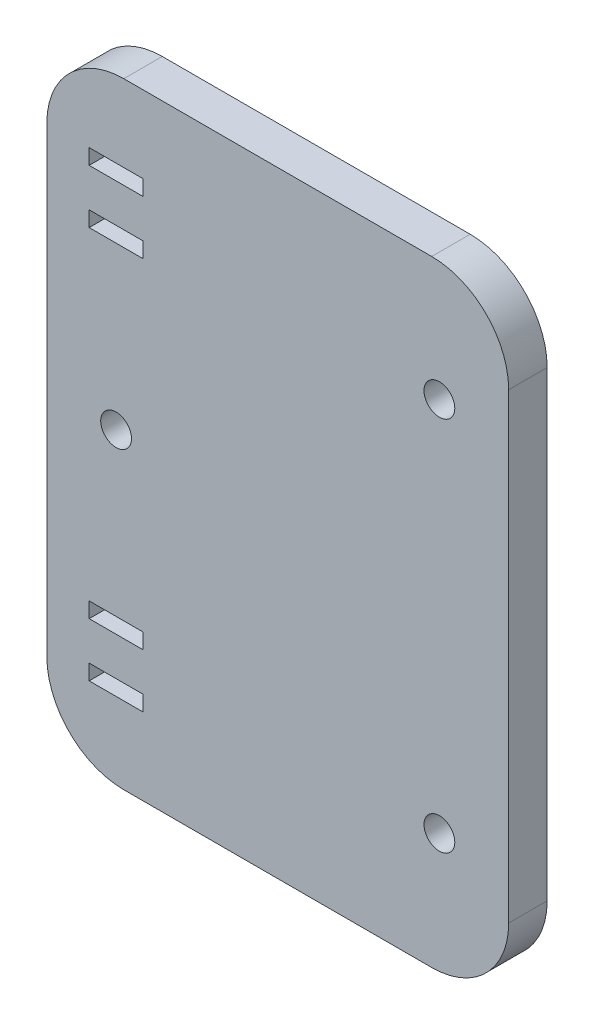
ISO-10303-21;
HEADER;
FILE_DESCRIPTION(('STEP AP214'),'2;1');
FILE_NAME('part.step','',(''),(''),'','','');
FILE_SCHEMA(('AUTOMOTIVE_DESIGN { 1 0 10303 214 1 1 1 1 }'));
ENDSEC;
DATA;
#1=APPLICATION_CONTEXT('core data for automotive mechanical design processes');
#2=APPLICATION_PROTOCOL_DEFINITION('international standard','automotive_design',2000,#1);
#3=PRODUCT_CONTEXT('',#1,'mechanical');
#4=PRODUCT('Part','Part','',(#3));
#5=PRODUCT_RELATED_PRODUCT_CATEGORY('part','',(#4));
#6=PRODUCT_DEFINITION_FORMATION('','',#4);
#7=PRODUCT_DEFINITION_CONTEXT('part definition',#1,'design');
#8=PRODUCT_DEFINITION('design','',#6,#7);
#9=PRODUCT_DEFINITION_SHAPE('','',#8);
#10=(LENGTH_UNIT() NAMED_UNIT(*) SI_UNIT(.MILLI.,.METRE.));
#11=(NAMED_UNIT(*) PLANE_ANGLE_UNIT() SI_UNIT($,.RADIAN.));
#12=(NAMED_UNIT(*) SI_UNIT($,.STERADIAN.) SOLID_ANGLE_UNIT());
#13=UNCERTAINTY_MEASURE_WITH_UNIT(LENGTH_MEASURE(1.E-05),#10,'distance_accuracy_value','');
#14=(GEOMETRIC_REPRESENTATION_CONTEXT(3) GLOBAL_UNCERTAINTY_ASSIGNED_CONTEXT((#13)) GLOBAL_UNIT_ASSIGNED_CONTEXT((#10,
#11,#12)) REPRESENTATION_CONTEXT('',''));
#15=CARTESIAN_POINT('',(0.,0.,0.));
#16=DIRECTION('',(0.,0.,1.));
#17=DIRECTION('',(1.,0.,0.));
#18=AXIS2_PLACEMENT_3D('',#15,#16,#17);
#19=CARTESIAN_POINT('',(-60.,0.,5.));
#20=DIRECTION('',(0.,1.,0.));
#21=DIRECTION('',(0.,0.,1.));
#22=AXIS2_PLACEMENT_3D('',#19,#20,#21);
#23=PLANE('',#22);
#24=DIRECTION('',(1.,0.,0.));
#25=VECTOR('',#24,1.);
#26=CARTESIAN_POINT('',(-60.,0.,5.));
#27=LINE('',#26,#25);
#28=CARTESIAN_POINT('',(-50.,0.,5.));
#29=VERTEX_POINT('',#28);
#30=CARTESIAN_POINT('',(-10.,0.,5.));
#31=VERTEX_POINT('',#30);
#32=EDGE_CURVE('E414',#29,#31,#27,.T.);
#33=ORIENTED_EDGE('',*,*,#32,.F.);
#34=DIRECTION('',(0.,0.,-1.));
#35=VECTOR('',#34,1.);
#36=CARTESIAN_POINT('',(-50.,0.,5.));
#37=LINE('',#36,#35);
#38=CARTESIAN_POINT('',(-50.,0.,0.));
#39=VERTEX_POINT('',#38);
#40=EDGE_CURVE('E445',#29,#39,#37,.T.);
#41=ORIENTED_EDGE('',*,*,#40,.T.);
#42=DIRECTION('',(1.,0.,0.));
#43=VECTOR('',#42,1.);
#44=CARTESIAN_POINT('',(-60.,0.,0.));
#45=LINE('',#44,#43);
#46=CARTESIAN_POINT('',(-10.,0.,0.));
#47=VERTEX_POINT('',#46);
#48=EDGE_CURVE('E394',#39,#47,#45,.T.);
#49=ORIENTED_EDGE('',*,*,#48,.T.);
#50=DIRECTION('',(0.,0.,-1.));
#51=VECTOR('',#50,1.);
#52=CARTESIAN_POINT('',(-10.,0.,5.));
#53=LINE('',#52,#51);
#54=EDGE_CURVE('E429',#47,#31,#53,.F.);
#55=ORIENTED_EDGE('',*,*,#54,.T.);
#56=EDGE_LOOP('',(#33,#41,#49,#55));
#57=FACE_BOUND('',#56,.T.);
#58=ADVANCED_FACE('F39',(#57),#23,.F.);
#59=CARTESIAN_POINT('',(0.,0.,5.));
#60=DIRECTION('',(-1.,0.,0.));
#61=DIRECTION('',(0.,0.,1.));
#62=AXIS2_PLACEMENT_3D('',#59,#60,#61);
#63=PLANE('',#62);
#64=DIRECTION('',(0.,1.,0.));
#65=VECTOR('',#64,1.);
#66=CARTESIAN_POINT('',(0.,0.,5.));
#67=LINE('',#66,#65);
#68=CARTESIAN_POINT('',(0.,10.,5.));
#69=VERTEX_POINT('',#68);
#70=CARTESIAN_POINT('',(0.,70.,5.));
#71=VERTEX_POINT('',#70);
#72=EDGE_CURVE('E418',#69,#71,#67,.T.);
#73=ORIENTED_EDGE('',*,*,#72,.F.);
#74=DIRECTION('',(0.,0.,-1.));
#75=VECTOR('',#74,1.);
#76=CARTESIAN_POINT('',(0.,10.,5.));
#77=LINE('',#76,#75);
#78=CARTESIAN_POINT('',(0.,10.,0.));
#79=VERTEX_POINT('',#78);
#80=EDGE_CURVE('E482',#69,#79,#77,.T.);
#81=ORIENTED_EDGE('',*,*,#80,.T.);
#82=DIRECTION('',(0.,1.,0.));
#83=VECTOR('',#82,1.);
#84=CARTESIAN_POINT('',(0.,0.,0.));
#85=LINE('',#84,#83);
#86=CARTESIAN_POINT('',(0.,70.,0.));
#87=VERTEX_POINT('',#86);
#88=EDGE_CURVE('E433',#79,#87,#85,.T.);
#89=ORIENTED_EDGE('',*,*,#88,.T.);
#90=DIRECTION('',(0.,0.,-1.));
#91=VECTOR('',#90,1.);
#92=CARTESIAN_POINT('',(0.,70.,5.));
#93=LINE('',#92,#91);
#94=EDGE_CURVE('E479',#87,#71,#93,.F.);
#95=ORIENTED_EDGE('',*,*,#94,.T.);
#96=EDGE_LOOP('',(#73,#81,#89,#95));
#97=FACE_BOUND('',#96,.T.);
#98=ADVANCED_FACE('F490',(#97),#63,.F.);
#99=CARTESIAN_POINT('',(0.,80.,5.));
#100=DIRECTION('',(0.,-1.,0.));
#101=DIRECTION('',(0.,0.,-1.));
#102=AXIS2_PLACEMENT_3D('',#99,#100,#101);
#103=PLANE('',#102);
#104=DIRECTION('',(-1.,0.,0.));
#105=VECTOR('',#104,1.);
#106=CARTESIAN_POINT('',(0.,80.,5.));
#107=LINE('',#106,#105);
#108=CARTESIAN_POINT('',(-10.,80.,5.));
#109=VERTEX_POINT('',#108);
#110=CARTESIAN_POINT('',(-50.,80.,5.));
#111=VERTEX_POINT('',#110);
#112=EDGE_CURVE('E422',#109,#111,#107,.T.);
#113=ORIENTED_EDGE('',*,*,#112,.F.);
#114=DIRECTION('',(0.,0.,-1.));
#115=VECTOR('',#114,1.);
#116=CARTESIAN_POINT('',(-10.,80.,5.));
#117=LINE('',#116,#115);
#118=CARTESIAN_POINT('',(-10.,80.,0.));
#119=VERTEX_POINT('',#118);
#120=EDGE_CURVE('E11',#109,#119,#117,.T.);
#121=ORIENTED_EDGE('',*,*,#120,.T.);
#122=DIRECTION('',(-1.,0.,0.));
#123=VECTOR('',#122,1.);
#124=CARTESIAN_POINT('',(0.,80.,0.));
#125=LINE('',#124,#123);
#126=CARTESIAN_POINT('',(-50.,80.,0.));
#127=VERTEX_POINT('',#126);
#128=EDGE_CURVE('E437',#119,#127,#125,.T.);
#129=ORIENTED_EDGE('',*,*,#128,.T.);
#130=DIRECTION('',(0.,0.,-1.));
#131=VECTOR('',#130,1.);
#132=CARTESIAN_POINT('',(-50.,80.,5.));
#133=LINE('',#132,#131);
#134=EDGE_CURVE('E48',#127,#111,#133,.F.);
#135=ORIENTED_EDGE('',*,*,#134,.T.);
#136=EDGE_LOOP('',(#113,#121,#129,#135));
#137=FACE_BOUND('',#136,.T.);
#138=ADVANCED_FACE('F500',(#137),#103,.F.);
#139=CARTESIAN_POINT('',(-60.,80.,5.));
#140=DIRECTION('',(1.,0.,0.));
#141=DIRECTION('',(0.,1.,0.));
#142=AXIS2_PLACEMENT_3D('',#139,#140,#141);
#143=PLANE('',#142);
#144=DIRECTION('',(0.,-1.,0.));
#145=VECTOR('',#144,1.);
#146=CARTESIAN_POINT('',(-60.,80.,0.));
#147=LINE('',#146,#145);
#148=CARTESIAN_POINT('',(-60.,70.,0.));
#149=VERTEX_POINT('',#148);
#150=CARTESIAN_POINT('',(-60.,9.99999999999999,0.));
#151=VERTEX_POINT('',#150);
#152=EDGE_CURVE('E419',#149,#151,#147,.T.);
#153=ORIENTED_EDGE('',*,*,#152,.T.);
#154=DIRECTION('',(0.,0.,-1.));
#155=VECTOR('',#154,1.);
#156=CARTESIAN_POINT('',(-60.,9.99999999999999,5.));
#157=LINE('',#156,#155);
#158=CARTESIAN_POINT('',(-60.,9.99999999999999,5.));
#159=VERTEX_POINT('',#158);
#160=EDGE_CURVE('E465',#151,#159,#157,.F.);
#161=ORIENTED_EDGE('',*,*,#160,.T.);
#162=DIRECTION('',(0.,-1.,0.));
#163=VECTOR('',#162,1.);
#164=CARTESIAN_POINT('',(-60.,80.,5.));
#165=LINE('',#164,#163);
#166=CARTESIAN_POINT('',(-60.,70.,5.));
#167=VERTEX_POINT('',#166);
#168=EDGE_CURVE('E425',#167,#159,#165,.T.);
#169=ORIENTED_EDGE('',*,*,#168,.F.);
#170=DIRECTION('',(0.,0.,-1.));
#171=VECTOR('',#170,1.);
#172=CARTESIAN_POINT('',(-60.,70.,5.));
#173=LINE('',#172,#171);
#174=EDGE_CURVE('E461',#167,#149,#173,.T.);
#175=ORIENTED_EDGE('',*,*,#174,.T.);
#176=EDGE_LOOP('',(#153,#161,#169,#175));
#177=FACE_BOUND('',#176,.T.);
#178=ADVANCED_FACE('F508',(#177),#143,.F.);
#179=CARTESIAN_POINT('',(0.,0.,5.));
#180=DIRECTION('',(0.,0.,1.));
#181=DIRECTION('',(1.,0.,0.));
#182=AXIS2_PLACEMENT_3D('',#179,#180,#181);
#183=PLANE('',#182);
#184=DIRECTION('',(1.,0.,0.));
#185=VECTOR('',#184,1.);
#186=CARTESIAN_POINT('',(-54.5,9.99999999999999,5.));
#187=LINE('',#186,#185);
#188=CARTESIAN_POINT('',(-54.5,9.99999999999999,5.));
#189=VERTEX_POINT('',#188);
#190=CARTESIAN_POINT('',(-47.5,9.99999999999999,5.));
#191=VERTEX_POINT('',#190);
#192=EDGE_CURVE('E321',#189,#191,#187,.T.);
#193=ORIENTED_EDGE('',*,*,#192,.F.);
#194=DIRECTION('',(0.,-1.,0.));
#195=VECTOR('',#194,1.);
#196=CARTESIAN_POINT('',(-54.5,9.99999999999999,5.));
#197=LINE('',#196,#195);
#198=CARTESIAN_POINT('',(-54.5,12.,5.));
#199=VERTEX_POINT('',#198);
#200=EDGE_CURVE('E308',#199,#189,#197,.T.);
#201=ORIENTED_EDGE('',*,*,#200,.F.);
#202=DIRECTION('',(-1.,0.,0.));
#203=VECTOR('',#202,1.);
#204=CARTESIAN_POINT('',(-54.5,12.,5.));
#205=LINE('',#204,#203);
#206=CARTESIAN_POINT('',(-47.5,12.,5.));
#207=VERTEX_POINT('',#206);
#208=EDGE_CURVE('E328',#207,#199,#205,.T.);
#209=ORIENTED_EDGE('',*,*,#208,.F.);
#210=DIRECTION('',(0.,1.,0.));
#211=VECTOR('',#210,1.);
#212=CARTESIAN_POINT('',(-47.5,9.99999999999999,5.));
#213=LINE('',#212,#211);
#214=EDGE_CURVE('E324',#191,#207,#213,.T.);
#215=ORIENTED_EDGE('',*,*,#214,.F.);
#216=EDGE_LOOP('',(#193,#201,#209,#215));
#217=FACE_BOUND('',#216,.T.);
#218=DIRECTION('',(1.,0.,0.));
#219=VECTOR('',#218,1.);
#220=CARTESIAN_POINT('',(-54.5,17.,5.));
#221=LINE('',#220,#219);
#222=CARTESIAN_POINT('',(-54.5,17.,5.));
#223=VERTEX_POINT('',#222);
#224=CARTESIAN_POINT('',(-47.5,17.,5.));
#225=VERTEX_POINT('',#224);
#226=EDGE_CURVE('E277',#223,#225,#221,.T.);
#227=ORIENTED_EDGE('',*,*,#226,.F.);
#228=DIRECTION('',(0.,-1.,0.));
#229=VECTOR('',#228,1.);
#230=CARTESIAN_POINT('',(-54.5,17.,5.));
#231=LINE('',#230,#229);
#232=CARTESIAN_POINT('',(-54.5,19.,5.));
#233=VERTEX_POINT('',#232);
#234=EDGE_CURVE('E264',#233,#223,#231,.T.);
#235=ORIENTED_EDGE('',*,*,#234,.F.);
#236=DIRECTION('',(-1.,0.,0.));
#237=VECTOR('',#236,1.);
#238=CARTESIAN_POINT('',(-54.5,19.,5.));
#239=LINE('',#238,#237);
#240=CARTESIAN_POINT('',(-47.5,19.,5.));
#241=VERTEX_POINT('',#240);
#242=EDGE_CURVE('E285',#241,#233,#239,.T.);
#243=ORIENTED_EDGE('',*,*,#242,.F.);
#244=DIRECTION('',(0.,1.,0.));
#245=VECTOR('',#244,1.);
#246=CARTESIAN_POINT('',(-47.5,17.,5.));
#247=LINE('',#246,#245);
#248=EDGE_CURVE('E280',#225,#241,#247,.T.);
#249=ORIENTED_EDGE('',*,*,#248,.F.);
#250=EDGE_LOOP('',(#227,#235,#243,#249));
#251=FACE_BOUND('',#250,.T.);
#252=DIRECTION('',(0.,-1.,0.));
#253=VECTOR('',#252,1.);
#254=CARTESIAN_POINT('',(-54.5,70.,5.));
#255=LINE('',#254,#253);
#256=CARTESIAN_POINT('',(-54.5,70.,5.));
#257=VERTEX_POINT('',#256);
#258=CARTESIAN_POINT('',(-54.5,68.,5.));
#259=VERTEX_POINT('',#258);
#260=EDGE_CURVE('E209',#257,#259,#255,.T.);
#261=ORIENTED_EDGE('',*,*,#260,.F.);
#262=DIRECTION('',(-1.,0.,0.));
#263=VECTOR('',#262,1.);
#264=CARTESIAN_POINT('',(-54.5,70.,5.));
#265=LINE('',#264,#263);
#266=CARTESIAN_POINT('',(-47.5,70.,5.));
#267=VERTEX_POINT('',#266);
#268=EDGE_CURVE('E230',#267,#257,#265,.T.);
#269=ORIENTED_EDGE('',*,*,#268,.F.);
#270=DIRECTION('',(0.,1.,0.));
#271=VECTOR('',#270,1.);
#272=CARTESIAN_POINT('',(-47.5,70.,5.));
#273=LINE('',#272,#271);
#274=CARTESIAN_POINT('',(-47.5,68.,5.));
#275=VERTEX_POINT('',#274);
#276=EDGE_CURVE('E234',#275,#267,#273,.T.);
#277=ORIENTED_EDGE('',*,*,#276,.F.);
#278=DIRECTION('',(1.,0.,0.));
#279=VECTOR('',#278,1.);
#280=CARTESIAN_POINT('',(-54.5,68.,5.));
#281=LINE('',#280,#279);
#282=EDGE_CURVE('E243',#259,#275,#281,.T.);
#283=ORIENTED_EDGE('',*,*,#282,.F.);
#284=EDGE_LOOP('',(#261,#269,#277,#283));
#285=FACE_BOUND('',#284,.T.);
#286=DIRECTION('',(0.,-1.,0.));
#287=VECTOR('',#286,1.);
#288=CARTESIAN_POINT('',(-54.5,63.,5.));
#289=LINE('',#288,#287);
#290=CARTESIAN_POINT('',(-54.5,63.,5.));
#291=VERTEX_POINT('',#290);
#292=CARTESIAN_POINT('',(-54.5,61.,5.));
#293=VERTEX_POINT('',#292);
#294=EDGE_CURVE('E253',#291,#293,#289,.T.);
#295=ORIENTED_EDGE('',*,*,#294,.F.);
#296=DIRECTION('',(-1.,0.,0.));
#297=VECTOR('',#296,1.);
#298=CARTESIAN_POINT('',(-54.5,63.,5.));
#299=LINE('',#298,#297);
#300=CARTESIAN_POINT('',(-47.5,63.,5.));
#301=VERTEX_POINT('',#300);
#302=EDGE_CURVE('E351',#301,#291,#299,.T.);
#303=ORIENTED_EDGE('',*,*,#302,.F.);
#304=DIRECTION('',(0.,1.,0.));
#305=VECTOR('',#304,1.);
#306=CARTESIAN_POINT('',(-47.5,63.,5.));
#307=LINE('',#306,#305);
#308=CARTESIAN_POINT('',(-47.5,61.,5.));
#309=VERTEX_POINT('',#308);
#310=EDGE_CURVE('E370',#309,#301,#307,.T.);
#311=ORIENTED_EDGE('',*,*,#310,.F.);
#312=DIRECTION('',(1.,0.,0.));
#313=VECTOR('',#312,1.);
#314=CARTESIAN_POINT('',(-54.5,61.,5.));
#315=LINE('',#314,#313);
#316=EDGE_CURVE('E366',#293,#309,#315,.T.);
#317=ORIENTED_EDGE('',*,*,#316,.F.);
#318=EDGE_LOOP('',(#295,#303,#311,#317));
#319=FACE_BOUND('',#318,.T.);
#320=CARTESIAN_POINT('',(-9.00000000000001,64.4115427318801,5.));
#321=DIRECTION('',(0.,0.,1.));
#322=DIRECTION('',(1.,0.,0.));
#323=AXIS2_PLACEMENT_3D('',#320,#321,#322);
#324=CIRCLE('',#323,2.);
#325=CARTESIAN_POINT('',(-7.,64.4115427318801,5.));
#326=VERTEX_POINT('',#325);
#327=EDGE_CURVE('E395',#326,#326,#324,.T.);
#328=ORIENTED_EDGE('',*,*,#327,.F.);
#329=EDGE_LOOP('',(#328));
#330=FACE_BOUND('',#329,.T.);
#331=CARTESIAN_POINT('',(-9.00000000000001,15.5884572681199,5.));
#332=DIRECTION('',(0.,0.,1.));
#333=DIRECTION('',(1.,0.,0.));
#334=AXIS2_PLACEMENT_3D('',#331,#332,#333);
#335=CIRCLE('',#334,2.);
#336=CARTESIAN_POINT('',(-7.,15.5884572681199,5.));
#337=VERTEX_POINT('',#336);
#338=EDGE_CURVE('E403',#337,#337,#335,.T.);
#339=ORIENTED_EDGE('',*,*,#338,.F.);
#340=EDGE_LOOP('',(#339));
#341=FACE_BOUND('',#340,.T.);
#342=CARTESIAN_POINT('',(-51.,40.,5.));
#343=DIRECTION('',(0.,0.,1.));
#344=DIRECTION('',(1.,0.,0.));
#345=AXIS2_PLACEMENT_3D('',#342,#343,#344);
#346=CIRCLE('',#345,2.);
#347=CARTESIAN_POINT('',(-49.,40.,5.));
#348=VERTEX_POINT('',#347);
#349=EDGE_CURVE('E380',#348,#348,#346,.T.);
#350=ORIENTED_EDGE('',*,*,#349,.F.);
#351=EDGE_LOOP('',(#350));
#352=FACE_BOUND('',#351,.T.);
#353=ORIENTED_EDGE('',*,*,#168,.T.);
#354=CARTESIAN_POINT('',(-50.,10.,5.));
#355=DIRECTION('',(0.,0.,1.));
#356=DIRECTION('',(1.,0.,0.));
#357=AXIS2_PLACEMENT_3D('',#354,#355,#356);
#358=CIRCLE('',#357,10.);
#359=EDGE_CURVE('E476',#159,#29,#358,.T.);
#360=ORIENTED_EDGE('',*,*,#359,.T.);
#361=ORIENTED_EDGE('',*,*,#32,.T.);
#362=CARTESIAN_POINT('',(-10.,10.,5.));
#363=DIRECTION('',(0.,0.,1.));
#364=DIRECTION('',(1.,0.,0.));
#365=AXIS2_PLACEMENT_3D('',#362,#363,#364);
#366=CIRCLE('',#365,10.);
#367=EDGE_CURVE('E473',#31,#69,#366,.T.);
#368=ORIENTED_EDGE('',*,*,#367,.T.);
#369=ORIENTED_EDGE('',*,*,#72,.T.);
#370=CARTESIAN_POINT('',(-10.,70.,5.));
#371=DIRECTION('',(0.,0.,1.));
#372=DIRECTION('',(1.,0.,0.));
#373=AXIS2_PLACEMENT_3D('',#370,#371,#372);
#374=CIRCLE('',#373,10.);
#375=EDGE_CURVE('E61',#71,#109,#374,.T.);
#376=ORIENTED_EDGE('',*,*,#375,.T.);
#377=ORIENTED_EDGE('',*,*,#112,.T.);
#378=CARTESIAN_POINT('',(-50.,70.,5.));
#379=DIRECTION('',(0.,0.,1.));
#380=DIRECTION('',(1.,0.,0.));
#381=AXIS2_PLACEMENT_3D('',#378,#379,#380);
#382=CIRCLE('',#381,10.);
#383=EDGE_CURVE('E468',#111,#167,#382,.T.);
#384=ORIENTED_EDGE('',*,*,#383,.T.);
#385=EDGE_LOOP('',(#353,#360,#361,#368,#369,#376,#377,#384));
#386=FACE_BOUND('',#385,.T.);
#387=ADVANCED_FACE('F502',(#217,#251,#285,#319,#330,#341,#352,#386),#183,.T.);
#388=CARTESIAN_POINT('',(0.,0.,0.));
#389=DIRECTION('',(0.,0.,1.));
#390=DIRECTION('',(1.,0.,0.));
#391=AXIS2_PLACEMENT_3D('',#388,#389,#390);
#392=PLANE('',#391);
#393=DIRECTION('',(0.,-1.,0.));
#394=VECTOR('',#393,1.);
#395=CARTESIAN_POINT('',(-54.5,9.99999999999999,0.));
#396=LINE('',#395,#394);
#397=CARTESIAN_POINT('',(-54.5,12.,0.));
#398=VERTEX_POINT('',#397);
#399=CARTESIAN_POINT('',(-54.5,9.99999999999999,0.));
#400=VERTEX_POINT('',#399);
#401=EDGE_CURVE('E316',#398,#400,#396,.T.);
#402=ORIENTED_EDGE('',*,*,#401,.T.);
#403=DIRECTION('',(1.,0.,0.));
#404=VECTOR('',#403,1.);
#405=CARTESIAN_POINT('',(-54.5,9.99999999999999,0.));
#406=LINE('',#405,#404);
#407=CARTESIAN_POINT('',(-47.5,9.99999999999999,0.));
#408=VERTEX_POINT('',#407);
#409=EDGE_CURVE('E303',#400,#408,#406,.T.);
#410=ORIENTED_EDGE('',*,*,#409,.T.);
#411=DIRECTION('',(0.,1.,0.));
#412=VECTOR('',#411,1.);
#413=CARTESIAN_POINT('',(-47.5,9.99999999999999,0.));
#414=LINE('',#413,#412);
#415=CARTESIAN_POINT('',(-47.5,12.,0.));
#416=VERTEX_POINT('',#415);
#417=EDGE_CURVE('E307',#408,#416,#414,.T.);
#418=ORIENTED_EDGE('',*,*,#417,.T.);
#419=DIRECTION('',(-1.,0.,0.));
#420=VECTOR('',#419,1.);
#421=CARTESIAN_POINT('',(-54.5,12.,0.));
#422=LINE('',#421,#420);
#423=EDGE_CURVE('E312',#416,#398,#422,.T.);
#424=ORIENTED_EDGE('',*,*,#423,.T.);
#425=EDGE_LOOP('',(#402,#410,#418,#424));
#426=FACE_BOUND('',#425,.T.);
#427=DIRECTION('',(0.,-1.,0.));
#428=VECTOR('',#427,1.);
#429=CARTESIAN_POINT('',(-54.5,17.,0.));
#430=LINE('',#429,#428);
#431=CARTESIAN_POINT('',(-54.5,19.,0.));
#432=VERTEX_POINT('',#431);
#433=CARTESIAN_POINT('',(-54.5,17.,0.));
#434=VERTEX_POINT('',#433);
#435=EDGE_CURVE('E272',#432,#434,#430,.T.);
#436=ORIENTED_EDGE('',*,*,#435,.T.);
#437=DIRECTION('',(1.,0.,0.));
#438=VECTOR('',#437,1.);
#439=CARTESIAN_POINT('',(-54.5,17.,0.));
#440=LINE('',#439,#438);
#441=CARTESIAN_POINT('',(-47.5,17.,0.));
#442=VERTEX_POINT('',#441);
#443=EDGE_CURVE('E259',#434,#442,#440,.T.);
#444=ORIENTED_EDGE('',*,*,#443,.T.);
#445=DIRECTION('',(0.,1.,0.));
#446=VECTOR('',#445,1.);
#447=CARTESIAN_POINT('',(-47.5,17.,0.));
#448=LINE('',#447,#446);
#449=CARTESIAN_POINT('',(-47.5,19.,0.));
#450=VERTEX_POINT('',#449);
#451=EDGE_CURVE('E263',#442,#450,#448,.T.);
#452=ORIENTED_EDGE('',*,*,#451,.T.);
#453=DIRECTION('',(-1.,0.,0.));
#454=VECTOR('',#453,1.);
#455=CARTESIAN_POINT('',(-54.5,19.,0.));
#456=LINE('',#455,#454);
#457=EDGE_CURVE('E268',#450,#432,#456,.T.);
#458=ORIENTED_EDGE('',*,*,#457,.T.);
#459=EDGE_LOOP('',(#436,#444,#452,#458));
#460=FACE_BOUND('',#459,.T.);
#461=DIRECTION('',(-1.,0.,0.));
#462=VECTOR('',#461,1.);
#463=CARTESIAN_POINT('',(-54.5,70.,0.));
#464=LINE('',#463,#462);
#465=CARTESIAN_POINT('',(-47.5,70.,0.));
#466=VERTEX_POINT('',#465);
#467=CARTESIAN_POINT('',(-54.5,70.,0.));
#468=VERTEX_POINT('',#467);
#469=EDGE_CURVE('E215',#466,#468,#464,.T.);
#470=ORIENTED_EDGE('',*,*,#469,.T.);
#471=DIRECTION('',(0.,-1.,0.));
#472=VECTOR('',#471,1.);
#473=CARTESIAN_POINT('',(-54.5,70.,0.));
#474=LINE('',#473,#472);
#475=CARTESIAN_POINT('',(-54.5,68.,0.));
#476=VERTEX_POINT('',#475);
#477=EDGE_CURVE('E206',#468,#476,#474,.T.);
#478=ORIENTED_EDGE('',*,*,#477,.T.);
#479=DIRECTION('',(1.,0.,0.));
#480=VECTOR('',#479,1.);
#481=CARTESIAN_POINT('',(-54.5,68.,0.));
#482=LINE('',#481,#480);
#483=CARTESIAN_POINT('',(-47.5,68.,0.));
#484=VERTEX_POINT('',#483);
#485=EDGE_CURVE('E219',#476,#484,#482,.T.);
#486=ORIENTED_EDGE('',*,*,#485,.T.);
#487=DIRECTION('',(0.,1.,0.));
#488=VECTOR('',#487,1.);
#489=CARTESIAN_POINT('',(-47.5,70.,0.));
#490=LINE('',#489,#488);
#491=EDGE_CURVE('E224',#484,#466,#490,.T.);
#492=ORIENTED_EDGE('',*,*,#491,.T.);
#493=EDGE_LOOP('',(#470,#478,#486,#492));
#494=FACE_BOUND('',#493,.T.);
#495=DIRECTION('',(-1.,0.,0.));
#496=VECTOR('',#495,1.);
#497=CARTESIAN_POINT('',(-54.5,63.,0.));
#498=LINE('',#497,#496);
#499=CARTESIAN_POINT('',(-47.5,63.,0.));
#500=VERTEX_POINT('',#499);
#501=CARTESIAN_POINT('',(-54.5,63.,0.));
#502=VERTEX_POINT('',#501);
#503=EDGE_CURVE('E359',#500,#502,#498,.T.);
#504=ORIENTED_EDGE('',*,*,#503,.T.);
#505=DIRECTION('',(0.,-1.,0.));
#506=VECTOR('',#505,1.);
#507=CARTESIAN_POINT('',(-54.5,63.,0.));
#508=LINE('',#507,#506);
#509=CARTESIAN_POINT('',(-54.5,61.,0.));
#510=VERTEX_POINT('',#509);
#511=EDGE_CURVE('E346',#502,#510,#508,.T.);
#512=ORIENTED_EDGE('',*,*,#511,.T.);
#513=DIRECTION('',(1.,0.,0.));
#514=VECTOR('',#513,1.);
#515=CARTESIAN_POINT('',(-54.5,61.,0.));
#516=LINE('',#515,#514);
#517=CARTESIAN_POINT('',(-47.5,61.,0.));
#518=VERTEX_POINT('',#517);
#519=EDGE_CURVE('E350',#510,#518,#516,.T.);
#520=ORIENTED_EDGE('',*,*,#519,.T.);
#521=DIRECTION('',(0.,1.,0.));
#522=VECTOR('',#521,1.);
#523=CARTESIAN_POINT('',(-47.5,63.,0.));
#524=LINE('',#523,#522);
#525=EDGE_CURVE('E355',#518,#500,#524,.T.);
#526=ORIENTED_EDGE('',*,*,#525,.T.);
#527=EDGE_LOOP('',(#504,#512,#520,#526));
#528=FACE_BOUND('',#527,.T.);
#529=CARTESIAN_POINT('',(-9.00000000000001,64.4115427318801,0.));
#530=DIRECTION('',(0.,0.,1.));
#531=DIRECTION('',(1.,0.,0.));
#532=AXIS2_PLACEMENT_3D('',#529,#530,#531);
#533=CIRCLE('',#532,2.);
#534=CARTESIAN_POINT('',(-7.,64.4115427318801,0.));
#535=VERTEX_POINT('',#534);
#536=EDGE_CURVE('E390',#535,#535,#533,.T.);
#537=ORIENTED_EDGE('',*,*,#536,.T.);
#538=EDGE_LOOP('',(#537));
#539=FACE_BOUND('',#538,.T.);
#540=CARTESIAN_POINT('',(-9.00000000000001,15.5884572681199,0.));
#541=DIRECTION('',(0.,0.,1.));
#542=DIRECTION('',(1.,0.,0.));
#543=AXIS2_PLACEMENT_3D('',#540,#541,#542);
#544=CIRCLE('',#543,2.);
#545=CARTESIAN_POINT('',(-7.,15.5884572681199,0.));
#546=VERTEX_POINT('',#545);
#547=EDGE_CURVE('E399',#546,#546,#544,.T.);
#548=ORIENTED_EDGE('',*,*,#547,.T.);
#549=EDGE_LOOP('',(#548));
#550=FACE_BOUND('',#549,.T.);
#551=CARTESIAN_POINT('',(-51.,40.,0.));
#552=DIRECTION('',(0.,0.,1.));
#553=DIRECTION('',(1.,0.,0.));
#554=AXIS2_PLACEMENT_3D('',#551,#552,#553);
#555=CIRCLE('',#554,2.);
#556=CARTESIAN_POINT('',(-49.,40.,0.));
#557=VERTEX_POINT('',#556);
#558=EDGE_CURVE('E407',#557,#557,#555,.T.);
#559=ORIENTED_EDGE('',*,*,#558,.T.);
#560=EDGE_LOOP('',(#559));
#561=FACE_BOUND('',#560,.T.);
#562=ORIENTED_EDGE('',*,*,#48,.F.);
#563=CARTESIAN_POINT('',(-50.,10.,0.));
#564=DIRECTION('',(0.,0.,1.));
#565=DIRECTION('',(1.,0.,0.));
#566=AXIS2_PLACEMENT_3D('',#563,#564,#565);
#567=CIRCLE('',#566,10.);
#568=EDGE_CURVE('E458',#39,#151,#567,.F.);
#569=ORIENTED_EDGE('',*,*,#568,.T.);
#570=ORIENTED_EDGE('',*,*,#152,.F.);
#571=CARTESIAN_POINT('',(-50.,70.,0.));
#572=DIRECTION('',(0.,0.,1.));
#573=DIRECTION('',(1.,0.,0.));
#574=AXIS2_PLACEMENT_3D('',#571,#572,#573);
#575=CIRCLE('',#574,10.);
#576=EDGE_CURVE('E449',#149,#127,#575,.F.);
#577=ORIENTED_EDGE('',*,*,#576,.T.);
#578=ORIENTED_EDGE('',*,*,#128,.F.);
#579=CARTESIAN_POINT('',(-10.,70.,0.));
#580=DIRECTION('',(0.,0.,1.));
#581=DIRECTION('',(1.,0.,0.));
#582=AXIS2_PLACEMENT_3D('',#579,#580,#581);
#583=CIRCLE('',#582,10.);
#584=EDGE_CURVE('E452',#119,#87,#583,.F.);
#585=ORIENTED_EDGE('',*,*,#584,.T.);
#586=ORIENTED_EDGE('',*,*,#88,.F.);
#587=CARTESIAN_POINT('',(-10.,10.,0.));
#588=DIRECTION('',(0.,0.,1.));
#589=DIRECTION('',(1.,0.,0.));
#590=AXIS2_PLACEMENT_3D('',#587,#588,#589);
#591=CIRCLE('',#590,10.);
#592=EDGE_CURVE('E455',#79,#47,#591,.F.);
#593=ORIENTED_EDGE('',*,*,#592,.T.);
#594=EDGE_LOOP('',(#562,#569,#570,#577,#578,#585,#586,#593));
#595=FACE_BOUND('',#594,.T.);
#596=ADVANCED_FACE('F226',(#426,#460,#494,#528,#539,#550,#561,#595),#392,.F.);
#597=CARTESIAN_POINT('',(-51.,40.,0.));
#598=DIRECTION('',(0.,0.,1.));
#599=DIRECTION('',(1.,0.,0.));
#600=AXIS2_PLACEMENT_3D('',#597,#598,#599);
#601=CYLINDRICAL_SURFACE('',#600,2.);
#602=ORIENTED_EDGE('',*,*,#558,.F.);
#603=EDGE_LOOP('',(#602));
#604=FACE_BOUND('',#603,.T.);
#605=ORIENTED_EDGE('',*,*,#349,.T.);
#606=EDGE_LOOP('',(#605));
#607=FACE_BOUND('',#606,.T.);
#608=ADVANCED_FACE('F539',(#604,#607),#601,.F.);
#609=CARTESIAN_POINT('',(-9.00000000000001,15.5884572681199,0.));
#610=DIRECTION('',(0.,0.,1.));
#611=DIRECTION('',(1.,0.,0.));
#612=AXIS2_PLACEMENT_3D('',#609,#610,#611);
#613=CYLINDRICAL_SURFACE('',#612,2.);
#614=ORIENTED_EDGE('',*,*,#547,.F.);
#615=EDGE_LOOP('',(#614));
#616=FACE_BOUND('',#615,.T.);
#617=ORIENTED_EDGE('',*,*,#338,.T.);
#618=EDGE_LOOP('',(#617));
#619=FACE_BOUND('',#618,.T.);
#620=ADVANCED_FACE('F546',(#616,#619),#613,.F.);
#621=CARTESIAN_POINT('',(-9.00000000000001,64.4115427318801,0.));
#622=DIRECTION('',(0.,0.,1.));
#623=DIRECTION('',(1.,0.,0.));
#624=AXIS2_PLACEMENT_3D('',#621,#622,#623);
#625=CYLINDRICAL_SURFACE('',#624,2.);
#626=ORIENTED_EDGE('',*,*,#536,.F.);
#627=EDGE_LOOP('',(#626));
#628=FACE_BOUND('',#627,.T.);
#629=ORIENTED_EDGE('',*,*,#327,.T.);
#630=EDGE_LOOP('',(#629));
#631=FACE_BOUND('',#630,.T.);
#632=ADVANCED_FACE('F550',(#628,#631),#625,.F.);
#633=CARTESIAN_POINT('',(-54.5,63.,0.));
#634=DIRECTION('',(-1.,0.,0.));
#635=DIRECTION('',(0.,0.,1.));
#636=AXIS2_PLACEMENT_3D('',#633,#634,#635);
#637=PLANE('',#636);
#638=ORIENTED_EDGE('',*,*,#294,.T.);
#639=DIRECTION('',(0.,0.,1.));
#640=VECTOR('',#639,1.);
#641=CARTESIAN_POINT('',(-54.5,61.,0.));
#642=LINE('',#641,#640);
#643=EDGE_CURVE('E363',#510,#293,#642,.T.);
#644=ORIENTED_EDGE('',*,*,#643,.F.);
#645=ORIENTED_EDGE('',*,*,#511,.F.);
#646=DIRECTION('',(0.,0.,1.));
#647=VECTOR('',#646,1.);
#648=CARTESIAN_POINT('',(-54.5,63.,0.));
#649=LINE('',#648,#647);
#650=EDGE_CURVE('E377',#502,#291,#649,.T.);
#651=ORIENTED_EDGE('',*,*,#650,.T.);
#652=EDGE_LOOP('',(#638,#644,#645,#651));
#653=FACE_BOUND('',#652,.T.);
#654=ADVANCED_FACE('F554',(#653),#637,.F.);
#655=CARTESIAN_POINT('',(-54.5,63.,0.));
#656=DIRECTION('',(0.,1.,0.));
#657=DIRECTION('',(0.,0.,1.));
#658=AXIS2_PLACEMENT_3D('',#655,#656,#657);
#659=PLANE('',#658);
#660=ORIENTED_EDGE('',*,*,#302,.T.);
#661=ORIENTED_EDGE('',*,*,#650,.F.);
#662=ORIENTED_EDGE('',*,*,#503,.F.);
#663=DIRECTION('',(0.,0.,1.));
#664=VECTOR('',#663,1.);
#665=CARTESIAN_POINT('',(-47.5,63.,0.));
#666=LINE('',#665,#664);
#667=EDGE_CURVE('E381',#500,#301,#666,.T.);
#668=ORIENTED_EDGE('',*,*,#667,.T.);
#669=EDGE_LOOP('',(#660,#661,#662,#668));
#670=FACE_BOUND('',#669,.T.);
#671=ADVANCED_FACE('F558',(#670),#659,.F.);
#672=CARTESIAN_POINT('',(-47.5,63.,0.));
#673=DIRECTION('',(1.,0.,0.));
#674=DIRECTION('',(0.,0.,-1.));
#675=AXIS2_PLACEMENT_3D('',#672,#673,#674);
#676=PLANE('',#675);
#677=ORIENTED_EDGE('',*,*,#310,.T.);
#678=ORIENTED_EDGE('',*,*,#667,.F.);
#679=ORIENTED_EDGE('',*,*,#525,.F.);
#680=DIRECTION('',(0.,0.,1.));
#681=VECTOR('',#680,1.);
#682=CARTESIAN_POINT('',(-47.5,61.,0.));
#683=LINE('',#682,#681);
#684=EDGE_CURVE('E384',#518,#309,#683,.T.);
#685=ORIENTED_EDGE('',*,*,#684,.T.);
#686=EDGE_LOOP('',(#677,#678,#679,#685));
#687=FACE_BOUND('',#686,.T.);
#688=ADVANCED_FACE('F563',(#687),#676,.F.);
#689=CARTESIAN_POINT('',(-54.5,61.,0.));
#690=DIRECTION('',(0.,-1.,0.));
#691=DIRECTION('',(0.,0.,-1.));
#692=AXIS2_PLACEMENT_3D('',#689,#690,#691);
#693=PLANE('',#692);
#694=ORIENTED_EDGE('',*,*,#316,.T.);
#695=ORIENTED_EDGE('',*,*,#684,.F.);
#696=ORIENTED_EDGE('',*,*,#519,.F.);
#697=ORIENTED_EDGE('',*,*,#643,.T.);
#698=EDGE_LOOP('',(#694,#695,#696,#697));
#699=FACE_BOUND('',#698,.T.);
#700=ADVANCED_FACE('F560',(#699),#693,.F.);
#701=CARTESIAN_POINT('',(-54.5,70.,0.));
#702=DIRECTION('',(-1.,0.,0.));
#703=DIRECTION('',(0.,0.,1.));
#704=AXIS2_PLACEMENT_3D('',#701,#702,#703);
#705=PLANE('',#704);
#706=ORIENTED_EDGE('',*,*,#260,.T.);
#707=DIRECTION('',(0.,0.,1.));
#708=VECTOR('',#707,1.);
#709=CARTESIAN_POINT('',(-54.5,68.,0.));
#710=LINE('',#709,#708);
#711=EDGE_CURVE('E202',#476,#259,#710,.T.);
#712=ORIENTED_EDGE('',*,*,#711,.F.);
#713=ORIENTED_EDGE('',*,*,#477,.F.);
#714=DIRECTION('',(0.,0.,1.));
#715=VECTOR('',#714,1.);
#716=CARTESIAN_POINT('',(-54.5,70.,0.));
#717=LINE('',#716,#715);
#718=EDGE_CURVE('E250',#468,#257,#717,.T.);
#719=ORIENTED_EDGE('',*,*,#718,.T.);
#720=EDGE_LOOP('',(#706,#712,#713,#719));
#721=FACE_BOUND('',#720,.T.);
#722=ADVANCED_FACE('F204',(#721),#705,.F.);
#723=CARTESIAN_POINT('',(-54.5,70.,0.));
#724=DIRECTION('',(0.,1.,0.));
#725=DIRECTION('',(0.,0.,1.));
#726=AXIS2_PLACEMENT_3D('',#723,#724,#725);
#727=PLANE('',#726);
#728=ORIENTED_EDGE('',*,*,#268,.T.);
#729=ORIENTED_EDGE('',*,*,#718,.F.);
#730=ORIENTED_EDGE('',*,*,#469,.F.);
#731=DIRECTION('',(0.,0.,1.));
#732=VECTOR('',#731,1.);
#733=CARTESIAN_POINT('',(-47.5,70.,0.));
#734=LINE('',#733,#732);
#735=EDGE_CURVE('E254',#466,#267,#734,.T.);
#736=ORIENTED_EDGE('',*,*,#735,.T.);
#737=EDGE_LOOP('',(#728,#729,#730,#736));
#738=FACE_BOUND('',#737,.T.);
#739=ADVANCED_FACE('F604',(#738),#727,.F.);
#740=CARTESIAN_POINT('',(-47.5,70.,0.));
#741=DIRECTION('',(1.,0.,0.));
#742=DIRECTION('',(0.,0.,-1.));
#743=AXIS2_PLACEMENT_3D('',#740,#741,#742);
#744=PLANE('',#743);
#745=ORIENTED_EDGE('',*,*,#276,.T.);
#746=ORIENTED_EDGE('',*,*,#735,.F.);
#747=ORIENTED_EDGE('',*,*,#491,.F.);
#748=DIRECTION('',(0.,0.,1.));
#749=VECTOR('',#748,1.);
#750=CARTESIAN_POINT('',(-47.5,68.,0.));
#751=LINE('',#750,#749);
#752=EDGE_CURVE('E214',#484,#275,#751,.T.);
#753=ORIENTED_EDGE('',*,*,#752,.T.);
#754=EDGE_LOOP('',(#745,#746,#747,#753));
#755=FACE_BOUND('',#754,.T.);
#756=ADVANCED_FACE('F607',(#755),#744,.F.);
#757=CARTESIAN_POINT('',(-54.5,68.,0.));
#758=DIRECTION('',(0.,-1.,0.));
#759=DIRECTION('',(0.,0.,-1.));
#760=AXIS2_PLACEMENT_3D('',#757,#758,#759);
#761=PLANE('',#760);
#762=ORIENTED_EDGE('',*,*,#282,.T.);
#763=ORIENTED_EDGE('',*,*,#752,.F.);
#764=ORIENTED_EDGE('',*,*,#485,.F.);
#765=ORIENTED_EDGE('',*,*,#711,.T.);
#766=EDGE_LOOP('',(#762,#763,#764,#765));
#767=FACE_BOUND('',#766,.T.);
#768=ADVANCED_FACE('F220',(#767),#761,.F.);
#769=CARTESIAN_POINT('',(-54.5,17.,0.));
#770=DIRECTION('',(0.,-1.,0.));
#771=DIRECTION('',(0.,0.,-1.));
#772=AXIS2_PLACEMENT_3D('',#769,#770,#771);
#773=PLANE('',#772);
#774=ORIENTED_EDGE('',*,*,#226,.T.);
#775=DIRECTION('',(0.,0.,1.));
#776=VECTOR('',#775,1.);
#777=CARTESIAN_POINT('',(-47.5,17.,0.));
#778=LINE('',#777,#776);
#779=EDGE_CURVE('E276',#442,#225,#778,.T.);
#780=ORIENTED_EDGE('',*,*,#779,.F.);
#781=ORIENTED_EDGE('',*,*,#443,.F.);
#782=DIRECTION('',(0.,0.,1.));
#783=VECTOR('',#782,1.);
#784=CARTESIAN_POINT('',(-54.5,17.,0.));
#785=LINE('',#784,#783);
#786=EDGE_CURVE('E244',#434,#223,#785,.T.);
#787=ORIENTED_EDGE('',*,*,#786,.T.);
#788=EDGE_LOOP('',(#774,#780,#781,#787));
#789=FACE_BOUND('',#788,.T.);
#790=ADVANCED_FACE('F587',(#789),#773,.F.);
#791=CARTESIAN_POINT('',(-54.5,17.,0.));
#792=DIRECTION('',(-1.,0.,0.));
#793=DIRECTION('',(0.,0.,1.));
#794=AXIS2_PLACEMENT_3D('',#791,#792,#793);
#795=PLANE('',#794);
#796=ORIENTED_EDGE('',*,*,#234,.T.);
#797=ORIENTED_EDGE('',*,*,#786,.F.);
#798=ORIENTED_EDGE('',*,*,#435,.F.);
#799=DIRECTION('',(0.,0.,1.));
#800=VECTOR('',#799,1.);
#801=CARTESIAN_POINT('',(-54.5,19.,0.));
#802=LINE('',#801,#800);
#803=EDGE_CURVE('E294',#432,#233,#802,.T.);
#804=ORIENTED_EDGE('',*,*,#803,.T.);
#805=EDGE_LOOP('',(#796,#797,#798,#804));
#806=FACE_BOUND('',#805,.T.);
#807=ADVANCED_FACE('F590',(#806),#795,.F.);
#808=CARTESIAN_POINT('',(-54.5,19.,0.));
#809=DIRECTION('',(0.,1.,0.));
#810=DIRECTION('',(0.,0.,1.));
#811=AXIS2_PLACEMENT_3D('',#808,#809,#810);
#812=PLANE('',#811);
#813=ORIENTED_EDGE('',*,*,#242,.T.);
#814=ORIENTED_EDGE('',*,*,#803,.F.);
#815=ORIENTED_EDGE('',*,*,#457,.F.);
#816=DIRECTION('',(0.,0.,1.));
#817=VECTOR('',#816,1.);
#818=CARTESIAN_POINT('',(-47.5,19.,0.));
#819=LINE('',#818,#817);
#820=EDGE_CURVE('E297',#450,#241,#819,.T.);
#821=ORIENTED_EDGE('',*,*,#820,.T.);
#822=EDGE_LOOP('',(#813,#814,#815,#821));
#823=FACE_BOUND('',#822,.T.);
#824=ADVANCED_FACE('F594',(#823),#812,.F.);
#825=CARTESIAN_POINT('',(-47.5,17.,0.));
#826=DIRECTION('',(1.,0.,0.));
#827=DIRECTION('',(0.,0.,-1.));
#828=AXIS2_PLACEMENT_3D('',#825,#826,#827);
#829=PLANE('',#828);
#830=ORIENTED_EDGE('',*,*,#248,.T.);
#831=ORIENTED_EDGE('',*,*,#820,.F.);
#832=ORIENTED_EDGE('',*,*,#451,.F.);
#833=ORIENTED_EDGE('',*,*,#779,.T.);
#834=EDGE_LOOP('',(#830,#831,#832,#833));
#835=FACE_BOUND('',#834,.T.);
#836=ADVANCED_FACE('F575',(#835),#829,.F.);
#837=CARTESIAN_POINT('',(-54.5,9.99999999999999,0.));
#838=DIRECTION('',(0.,-1.,0.));
#839=DIRECTION('',(0.,0.,-1.));
#840=AXIS2_PLACEMENT_3D('',#837,#838,#839);
#841=PLANE('',#840);
#842=ORIENTED_EDGE('',*,*,#192,.T.);
#843=DIRECTION('',(0.,0.,1.));
#844=VECTOR('',#843,1.);
#845=CARTESIAN_POINT('',(-47.5,9.99999999999999,0.));
#846=LINE('',#845,#844);
#847=EDGE_CURVE('E320',#408,#191,#846,.T.);
#848=ORIENTED_EDGE('',*,*,#847,.F.);
#849=ORIENTED_EDGE('',*,*,#409,.F.);
#850=DIRECTION('',(0.,0.,1.));
#851=VECTOR('',#850,1.);
#852=CARTESIAN_POINT('',(-54.5,9.99999999999999,0.));
#853=LINE('',#852,#851);
#854=EDGE_CURVE('E281',#400,#189,#853,.T.);
#855=ORIENTED_EDGE('',*,*,#854,.T.);
#856=EDGE_LOOP('',(#842,#848,#849,#855));
#857=FACE_BOUND('',#856,.T.);
#858=ADVANCED_FACE('F571',(#857),#841,.F.);
#859=CARTESIAN_POINT('',(-54.5,9.99999999999999,0.));
#860=DIRECTION('',(-1.,0.,0.));
#861=DIRECTION('',(0.,0.,1.));
#862=AXIS2_PLACEMENT_3D('',#859,#860,#861);
#863=PLANE('',#862);
#864=ORIENTED_EDGE('',*,*,#200,.T.);
#865=ORIENTED_EDGE('',*,*,#854,.F.);
#866=ORIENTED_EDGE('',*,*,#401,.F.);
#867=DIRECTION('',(0.,0.,1.));
#868=VECTOR('',#867,1.);
#869=CARTESIAN_POINT('',(-54.5,12.,0.));
#870=LINE('',#869,#868);
#871=EDGE_CURVE('E337',#398,#199,#870,.T.);
#872=ORIENTED_EDGE('',*,*,#871,.T.);
#873=EDGE_LOOP('',(#864,#865,#866,#872));
#874=FACE_BOUND('',#873,.T.);
#875=ADVANCED_FACE('F574',(#874),#863,.F.);
#876=CARTESIAN_POINT('',(-54.5,12.,0.));
#877=DIRECTION('',(0.,1.,0.));
#878=DIRECTION('',(0.,0.,1.));
#879=AXIS2_PLACEMENT_3D('',#876,#877,#878);
#880=PLANE('',#879);
#881=ORIENTED_EDGE('',*,*,#208,.T.);
#882=ORIENTED_EDGE('',*,*,#871,.F.);
#883=ORIENTED_EDGE('',*,*,#423,.F.);
#884=DIRECTION('',(0.,0.,1.));
#885=VECTOR('',#884,1.);
#886=CARTESIAN_POINT('',(-47.5,12.,0.));
#887=LINE('',#886,#885);
#888=EDGE_CURVE('E340',#416,#207,#887,.T.);
#889=ORIENTED_EDGE('',*,*,#888,.T.);
#890=EDGE_LOOP('',(#881,#882,#883,#889));
#891=FACE_BOUND('',#890,.T.);
#892=ADVANCED_FACE('F579',(#891),#880,.F.);
#893=CARTESIAN_POINT('',(-47.5,9.99999999999999,0.));
#894=DIRECTION('',(1.,0.,0.));
#895=DIRECTION('',(0.,0.,-1.));
#896=AXIS2_PLACEMENT_3D('',#893,#894,#895);
#897=PLANE('',#896);
#898=ORIENTED_EDGE('',*,*,#214,.T.);
#899=ORIENTED_EDGE('',*,*,#888,.F.);
#900=ORIENTED_EDGE('',*,*,#417,.F.);
#901=ORIENTED_EDGE('',*,*,#847,.T.);
#902=EDGE_LOOP('',(#898,#899,#900,#901));
#903=FACE_BOUND('',#902,.T.);
#904=ADVANCED_FACE('F524',(#903),#897,.F.);
#905=CARTESIAN_POINT('',(-50.,10.,5.));
#906=DIRECTION('',(0.,0.,-1.));
#907=DIRECTION('',(-1.,0.,0.));
#908=AXIS2_PLACEMENT_3D('',#905,#906,#907);
#909=CYLINDRICAL_SURFACE('',#908,10.);
#910=ORIENTED_EDGE('',*,*,#359,.F.);
#911=ORIENTED_EDGE('',*,*,#160,.F.);
#912=ORIENTED_EDGE('',*,*,#568,.F.);
#913=ORIENTED_EDGE('',*,*,#40,.F.);
#914=EDGE_LOOP('',(#910,#911,#912,#913));
#915=FACE_BOUND('',#914,.T.);
#916=ADVANCED_FACE('F513',(#915),#909,.T.);
#917=CARTESIAN_POINT('',(-10.,10.,5.));
#918=DIRECTION('',(0.,0.,-1.));
#919=DIRECTION('',(-1.,0.,0.));
#920=AXIS2_PLACEMENT_3D('',#917,#918,#919);
#921=CYLINDRICAL_SURFACE('',#920,10.);
#922=ORIENTED_EDGE('',*,*,#367,.F.);
#923=ORIENTED_EDGE('',*,*,#54,.F.);
#924=ORIENTED_EDGE('',*,*,#592,.F.);
#925=ORIENTED_EDGE('',*,*,#80,.F.);
#926=EDGE_LOOP('',(#922,#923,#924,#925));
#927=FACE_BOUND('',#926,.T.);
#928=ADVANCED_FACE('F517',(#927),#921,.T.);
#929=CARTESIAN_POINT('',(-10.,70.,5.));
#930=DIRECTION('',(0.,0.,-1.));
#931=DIRECTION('',(-1.,0.,0.));
#932=AXIS2_PLACEMENT_3D('',#929,#930,#931);
#933=CYLINDRICAL_SURFACE('',#932,10.);
#934=ORIENTED_EDGE('',*,*,#375,.F.);
#935=ORIENTED_EDGE('',*,*,#94,.F.);
#936=ORIENTED_EDGE('',*,*,#584,.F.);
#937=ORIENTED_EDGE('',*,*,#120,.F.);
#938=EDGE_LOOP('',(#934,#935,#936,#937));
#939=FACE_BOUND('',#938,.T.);
#940=ADVANCED_FACE('F499',(#939),#933,.T.);
#941=CARTESIAN_POINT('',(-50.,70.,5.));
#942=DIRECTION('',(0.,0.,-1.));
#943=DIRECTION('',(-1.,0.,0.));
#944=AXIS2_PLACEMENT_3D('',#941,#942,#943);
#945=CYLINDRICAL_SURFACE('',#944,10.);
#946=ORIENTED_EDGE('',*,*,#383,.F.);
#947=ORIENTED_EDGE('',*,*,#134,.F.);
#948=ORIENTED_EDGE('',*,*,#576,.F.);
#949=ORIENTED_EDGE('',*,*,#174,.F.);
#950=EDGE_LOOP('',(#946,#947,#948,#949));
#951=FACE_BOUND('',#950,.T.);
#952=ADVANCED_FACE('F41',(#951),#945,.T.);
#953=CLOSED_SHELL('',(#58,#98,#138,#178,#387,#596,#608,#620,#632,#654,#671,#688,#700,#722,#739,
#756,#768,#790,#807,#824,#836,#858,#875,#892,#904,#916,#928,#940,#952));
#954=MANIFOLD_SOLID_BREP('B2',#953);
#955=ADVANCED_BREP_SHAPE_REPRESENTATION('',(#18,#954),#14);
#956=SHAPE_DEFINITION_REPRESENTATION(#9,#955);
ENDSEC;
END-ISO-10303-21;
